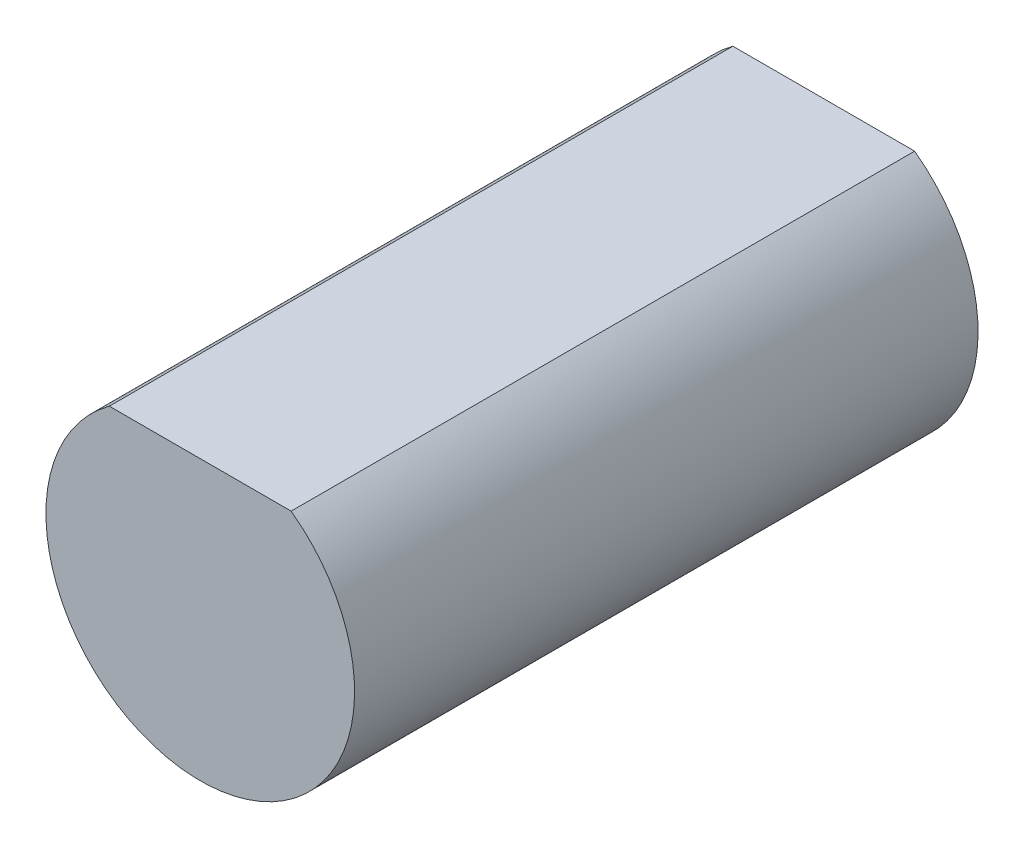
ISO-10303-21;
HEADER;
FILE_DESCRIPTION(('STEP AP214'),'2;1');
FILE_NAME('part.step','',(''),(''),'','','');
FILE_SCHEMA(('AUTOMOTIVE_DESIGN { 1 0 10303 214 1 1 1 1 }'));
ENDSEC;
DATA;
#1=APPLICATION_CONTEXT('core data for automotive mechanical design processes');
#2=APPLICATION_PROTOCOL_DEFINITION('international standard','automotive_design',2000,#1);
#3=PRODUCT_CONTEXT('',#1,'mechanical');
#4=PRODUCT('Part','Part','',(#3));
#5=PRODUCT_RELATED_PRODUCT_CATEGORY('part','',(#4));
#6=PRODUCT_DEFINITION_FORMATION('','',#4);
#7=PRODUCT_DEFINITION_CONTEXT('part definition',#1,'design');
#8=PRODUCT_DEFINITION('design','',#6,#7);
#9=PRODUCT_DEFINITION_SHAPE('','',#8);
#10=(LENGTH_UNIT() NAMED_UNIT(*) SI_UNIT(.MILLI.,.METRE.));
#11=(NAMED_UNIT(*) PLANE_ANGLE_UNIT() SI_UNIT($,.RADIAN.));
#12=(NAMED_UNIT(*) SI_UNIT($,.STERADIAN.) SOLID_ANGLE_UNIT());
#13=UNCERTAINTY_MEASURE_WITH_UNIT(LENGTH_MEASURE(1.E-05),#10,'distance_accuracy_value','');
#14=(GEOMETRIC_REPRESENTATION_CONTEXT(3) GLOBAL_UNCERTAINTY_ASSIGNED_CONTEXT((#13)) GLOBAL_UNIT_ASSIGNED_CONTEXT((#10,
#11,#12)) REPRESENTATION_CONTEXT('',''));
#15=CARTESIAN_POINT('',(0.,0.,0.));
#16=DIRECTION('',(0.,0.,1.));
#17=DIRECTION('',(1.,0.,0.));
#18=AXIS2_PLACEMENT_3D('',#15,#16,#17);
#19=CARTESIAN_POINT('',(0.,0.,40.));
#20=DIRECTION('',(0.,0.,-1.));
#21=DIRECTION('',(-1.,0.,0.));
#22=AXIS2_PLACEMENT_3D('',#19,#20,#21);
#23=CYLINDRICAL_SURFACE('',#22,9.9);
#24=CARTESIAN_POINT('',(0.,0.,40.));
#25=DIRECTION('',(0.,0.,1.));
#26=DIRECTION('',(1.,0.,0.));
#27=AXIS2_PLACEMENT_3D('',#24,#25,#26);
#28=CIRCLE('',#27,9.9);
#29=CARTESIAN_POINT('',(-5.83180932472933,8.,40.));
#30=VERTEX_POINT('',#29);
#31=CARTESIAN_POINT('',(5.83180932472933,8.,40.));
#32=VERTEX_POINT('',#31);
#33=EDGE_CURVE('E42',#30,#32,#28,.T.);
#34=ORIENTED_EDGE('',*,*,#33,.F.);
#35=DIRECTION('',(0.,0.,-1.));
#36=VECTOR('',#35,1.);
#37=CARTESIAN_POINT('',(-5.83180932472933,8.,40.));
#38=LINE('',#37,#36);
#39=CARTESIAN_POINT('',(-5.83180932472933,8.,0.));
#40=VERTEX_POINT('',#39);
#41=EDGE_CURVE('E56',#30,#40,#38,.T.);
#42=ORIENTED_EDGE('',*,*,#41,.T.);
#43=CARTESIAN_POINT('',(0.,0.,0.));
#44=DIRECTION('',(0.,0.,1.));
#45=DIRECTION('',(1.,0.,0.));
#46=AXIS2_PLACEMENT_3D('',#43,#44,#45);
#47=CIRCLE('',#46,9.9);
#48=CARTESIAN_POINT('',(5.83180932472933,8.,0.));
#49=VERTEX_POINT('',#48);
#50=EDGE_CURVE('E64',#40,#49,#47,.T.);
#51=ORIENTED_EDGE('',*,*,#50,.T.);
#52=DIRECTION('',(0.,0.,-1.));
#53=VECTOR('',#52,1.);
#54=CARTESIAN_POINT('',(5.83180932472933,8.,40.));
#55=LINE('',#54,#53);
#56=EDGE_CURVE('E49',#49,#32,#55,.F.);
#57=ORIENTED_EDGE('',*,*,#56,.T.);
#58=EDGE_LOOP('',(#34,#42,#51,#57));
#59=FACE_BOUND('',#58,.T.);
#60=ADVANCED_FACE('F35',(#59),#23,.T.);
#61=CARTESIAN_POINT('',(0.,0.,40.));
#62=DIRECTION('',(0.,0.,1.));
#63=DIRECTION('',(1.,0.,0.));
#64=AXIS2_PLACEMENT_3D('',#61,#62,#63);
#65=PLANE('',#64);
#66=DIRECTION('',(1.,0.,0.));
#67=VECTOR('',#66,1.);
#68=CARTESIAN_POINT('',(-6.,8.,40.));
#69=LINE('',#68,#67);
#70=EDGE_CURVE('E59',#30,#32,#69,.T.);
#71=ORIENTED_EDGE('',*,*,#70,.F.);
#72=ORIENTED_EDGE('',*,*,#33,.T.);
#73=EDGE_LOOP('',(#71,#72));
#74=FACE_BOUND('',#73,.T.);
#75=ADVANCED_FACE('F68',(#74),#65,.T.);
#76=CARTESIAN_POINT('',(0.,0.,0.));
#77=DIRECTION('',(0.,0.,1.));
#78=DIRECTION('',(1.,0.,0.));
#79=AXIS2_PLACEMENT_3D('',#76,#77,#78);
#80=PLANE('',#79);
#81=ORIENTED_EDGE('',*,*,#50,.F.);
#82=DIRECTION('',(1.,0.,0.));
#83=VECTOR('',#82,1.);
#84=CARTESIAN_POINT('',(0.,8.,0.));
#85=LINE('',#84,#83);
#86=EDGE_CURVE('E11',#40,#49,#85,.T.);
#87=ORIENTED_EDGE('',*,*,#86,.T.);
#88=EDGE_LOOP('',(#81,#87));
#89=FACE_BOUND('',#88,.T.);
#90=ADVANCED_FACE('F73',(#89),#80,.F.);
#91=CARTESIAN_POINT('',(-6.,8.,0.));
#92=DIRECTION('',(0.,-1.,0.));
#93=DIRECTION('',(0.,0.,-1.));
#94=AXIS2_PLACEMENT_3D('',#91,#92,#93);
#95=PLANE('',#94);
#96=ORIENTED_EDGE('',*,*,#70,.T.);
#97=ORIENTED_EDGE('',*,*,#56,.F.);
#98=ORIENTED_EDGE('',*,*,#86,.F.);
#99=ORIENTED_EDGE('',*,*,#41,.F.);
#100=EDGE_LOOP('',(#96,#97,#98,#99));
#101=FACE_BOUND('',#100,.T.);
#102=ADVANCED_FACE('F58',(#101),#95,.F.);
#103=CLOSED_SHELL('',(#60,#75,#90,#102));
#104=MANIFOLD_SOLID_BREP('B2',#103);
#105=ADVANCED_BREP_SHAPE_REPRESENTATION('',(#18,#104),#14);
#106=SHAPE_DEFINITION_REPRESENTATION(#9,#105);
ENDSEC;
END-ISO-10303-21;
